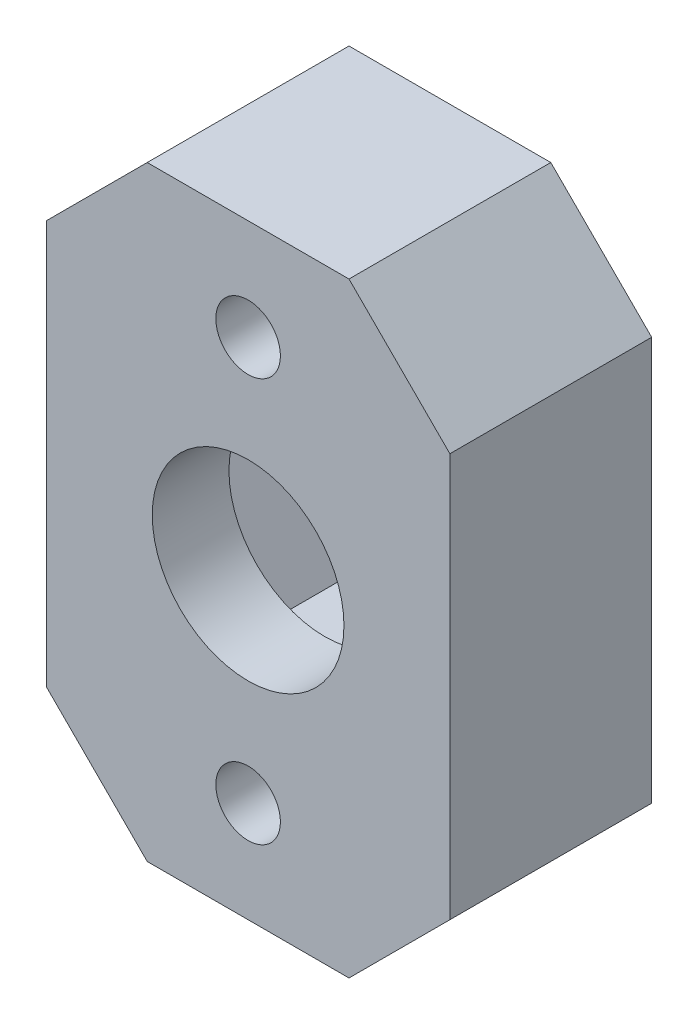
ISO-10303-21;
HEADER;
FILE_DESCRIPTION(('STEP AP214'),'2;1');
FILE_NAME('part.step','',(''),(''),'','','');
FILE_SCHEMA(('AUTOMOTIVE_DESIGN { 1 0 10303 214 1 1 1 1 }'));
ENDSEC;
DATA;
#1=APPLICATION_CONTEXT('core data for automotive mechanical design processes');
#2=APPLICATION_PROTOCOL_DEFINITION('international standard','automotive_design',2000,#1);
#3=PRODUCT_CONTEXT('',#1,'mechanical');
#4=PRODUCT('Part','Part','',(#3));
#5=PRODUCT_RELATED_PRODUCT_CATEGORY('part','',(#4));
#6=PRODUCT_DEFINITION_FORMATION('','',#4);
#7=PRODUCT_DEFINITION_CONTEXT('part definition',#1,'design');
#8=PRODUCT_DEFINITION('design','',#6,#7);
#9=PRODUCT_DEFINITION_SHAPE('','',#8);
#10=(LENGTH_UNIT() NAMED_UNIT(*) SI_UNIT(.MILLI.,.METRE.));
#11=(NAMED_UNIT(*) PLANE_ANGLE_UNIT() SI_UNIT($,.RADIAN.));
#12=(NAMED_UNIT(*) SI_UNIT($,.STERADIAN.) SOLID_ANGLE_UNIT());
#13=UNCERTAINTY_MEASURE_WITH_UNIT(LENGTH_MEASURE(1.E-05),#10,'distance_accuracy_value','');
#14=(GEOMETRIC_REPRESENTATION_CONTEXT(3) GLOBAL_UNCERTAINTY_ASSIGNED_CONTEXT((#13)) GLOBAL_UNIT_ASSIGNED_CONTEXT((#10,
#11,#12)) REPRESENTATION_CONTEXT('',''));
#15=CARTESIAN_POINT('',(0.,0.,0.));
#16=DIRECTION('',(0.,0.,1.));
#17=DIRECTION('',(1.,0.,0.));
#18=AXIS2_PLACEMENT_3D('',#15,#16,#17);
#19=CARTESIAN_POINT('',(3.72390923627309,-6.45,10.));
#20=DIRECTION('',(-0.866025403784439,0.5,0.));
#21=DIRECTION('',(-0.5,-0.866025403784439,0.));
#22=AXIS2_PLACEMENT_3D('',#19,#20,#21);
#23=PLANE('',#22);
#24=DIRECTION('',(0.,0.,-1.));
#25=VECTOR('',#24,1.);
#26=CARTESIAN_POINT('',(3.72390923627309,-6.45,10.));
#27=LINE('',#26,#25);
#28=CARTESIAN_POINT('',(3.72390923627309,-6.45,6.2));
#29=VERTEX_POINT('',#28);
#30=CARTESIAN_POINT('',(3.72390923627309,-6.45,0.));
#31=VERTEX_POINT('',#30);
#32=EDGE_CURVE('E154',#29,#31,#27,.T.);
#33=ORIENTED_EDGE('',*,*,#32,.F.);
#34=DIRECTION('',(0.5,0.866025403784439,0.));
#35=VECTOR('',#34,1.);
#36=CARTESIAN_POINT('',(3.72390923627309,-6.45,6.2));
#37=LINE('',#36,#35);
#38=CARTESIAN_POINT('',(7.44781847254617,0.,6.2));
#39=VERTEX_POINT('',#38);
#40=EDGE_CURVE('E48',#29,#39,#37,.T.);
#41=ORIENTED_EDGE('',*,*,#40,.T.);
#42=DIRECTION('',(0.,0.,-1.));
#43=VECTOR('',#42,1.);
#44=CARTESIAN_POINT('',(7.44781847254617,0.,10.));
#45=LINE('',#44,#43);
#46=CARTESIAN_POINT('',(7.44781847254617,0.,0.));
#47=VERTEX_POINT('',#46);
#48=EDGE_CURVE('E164',#39,#47,#45,.T.);
#49=ORIENTED_EDGE('',*,*,#48,.T.);
#50=DIRECTION('',(0.5,0.866025403784439,0.));
#51=VECTOR('',#50,1.);
#52=CARTESIAN_POINT('',(3.72390923627309,-6.45,0.));
#53=LINE('',#52,#51);
#54=EDGE_CURVE('E346',#31,#47,#53,.T.);
#55=ORIENTED_EDGE('',*,*,#54,.F.);
#56=EDGE_LOOP('',(#33,#41,#49,#55));
#57=FACE_BOUND('',#56,.T.);
#58=ADVANCED_FACE('F33',(#57),#23,.T.);
#59=CARTESIAN_POINT('',(7.44781847254617,0.,10.));
#60=DIRECTION('',(-0.866025403784438,-0.5,0.));
#61=DIRECTION('',(0.5,-0.866025403784439,0.));
#62=AXIS2_PLACEMENT_3D('',#59,#60,#61);
#63=PLANE('',#62);
#64=ORIENTED_EDGE('',*,*,#48,.F.);
#65=DIRECTION('',(-0.5,0.866025403784439,0.));
#66=VECTOR('',#65,1.);
#67=CARTESIAN_POINT('',(7.44781847254617,0.,6.2));
#68=LINE('',#67,#66);
#69=CARTESIAN_POINT('',(3.72390923627308,6.45,6.2));
#70=VERTEX_POINT('',#69);
#71=EDGE_CURVE('E331',#39,#70,#68,.T.);
#72=ORIENTED_EDGE('',*,*,#71,.T.);
#73=DIRECTION('',(0.,0.,-1.));
#74=VECTOR('',#73,1.);
#75=CARTESIAN_POINT('',(3.72390923627308,6.45,10.));
#76=LINE('',#75,#74);
#77=CARTESIAN_POINT('',(3.72390923627308,6.45,0.));
#78=VERTEX_POINT('',#77);
#79=EDGE_CURVE('E162',#70,#78,#76,.T.);
#80=ORIENTED_EDGE('',*,*,#79,.T.);
#81=DIRECTION('',(-0.5,0.866025403784438,0.));
#82=VECTOR('',#81,1.);
#83=CARTESIAN_POINT('',(7.44781847254617,0.,0.));
#84=LINE('',#83,#82);
#85=EDGE_CURVE('E329',#47,#78,#84,.T.);
#86=ORIENTED_EDGE('',*,*,#85,.F.);
#87=EDGE_LOOP('',(#64,#72,#80,#86));
#88=FACE_BOUND('',#87,.T.);
#89=ADVANCED_FACE('F265',(#88),#63,.T.);
#90=CARTESIAN_POINT('',(3.72390923627308,6.45,10.));
#91=DIRECTION('',(0.,-1.,0.));
#92=DIRECTION('',(1.,0.,0.));
#93=AXIS2_PLACEMENT_3D('',#90,#91,#92);
#94=PLANE('',#93);
#95=ORIENTED_EDGE('',*,*,#79,.F.);
#96=DIRECTION('',(-1.,0.,0.));
#97=VECTOR('',#96,1.);
#98=CARTESIAN_POINT('',(3.72390923627308,6.45,6.2));
#99=LINE('',#98,#97);
#100=CARTESIAN_POINT('',(-3.72390923627309,6.45,6.2));
#101=VERTEX_POINT('',#100);
#102=EDGE_CURVE('E321',#70,#101,#99,.T.);
#103=ORIENTED_EDGE('',*,*,#102,.T.);
#104=DIRECTION('',(0.,0.,-1.));
#105=VECTOR('',#104,1.);
#106=CARTESIAN_POINT('',(-3.72390923627309,6.45,10.));
#107=LINE('',#106,#105);
#108=CARTESIAN_POINT('',(-3.72390923627309,6.45,0.));
#109=VERTEX_POINT('',#108);
#110=EDGE_CURVE('E156',#101,#109,#107,.T.);
#111=ORIENTED_EDGE('',*,*,#110,.T.);
#112=DIRECTION('',(-1.,0.,0.));
#113=VECTOR('',#112,1.);
#114=CARTESIAN_POINT('',(3.72390923627308,6.45,0.));
#115=LINE('',#114,#113);
#116=EDGE_CURVE('E324',#78,#109,#115,.T.);
#117=ORIENTED_EDGE('',*,*,#116,.F.);
#118=EDGE_LOOP('',(#95,#103,#111,#117));
#119=FACE_BOUND('',#118,.T.);
#120=ADVANCED_FACE('F271',(#119),#94,.T.);
#121=CARTESIAN_POINT('',(-3.72390923627309,6.45,10.));
#122=DIRECTION('',(0.866025403784439,-0.5,0.));
#123=DIRECTION('',(0.5,0.866025403784439,0.));
#124=AXIS2_PLACEMENT_3D('',#121,#122,#123);
#125=PLANE('',#124);
#126=ORIENTED_EDGE('',*,*,#110,.F.);
#127=DIRECTION('',(-0.5,-0.866025403784439,0.));
#128=VECTOR('',#127,1.);
#129=CARTESIAN_POINT('',(-3.72390923627309,6.45,6.2));
#130=LINE('',#129,#128);
#131=CARTESIAN_POINT('',(-7.44781847254617,0.,6.2));
#132=VERTEX_POINT('',#131);
#133=EDGE_CURVE('E147',#101,#132,#130,.T.);
#134=ORIENTED_EDGE('',*,*,#133,.T.);
#135=DIRECTION('',(0.,0.,-1.));
#136=VECTOR('',#135,1.);
#137=CARTESIAN_POINT('',(-7.44781847254617,0.,10.));
#138=LINE('',#137,#136);
#139=CARTESIAN_POINT('',(-7.44781847254617,0.,0.));
#140=VERTEX_POINT('',#139);
#141=EDGE_CURVE('E146',#132,#140,#138,.T.);
#142=ORIENTED_EDGE('',*,*,#141,.T.);
#143=DIRECTION('',(-0.5,-0.866025403784438,0.));
#144=VECTOR('',#143,1.);
#145=CARTESIAN_POINT('',(-3.72390923627309,6.45,0.));
#146=LINE('',#145,#144);
#147=EDGE_CURVE('E352',#109,#140,#146,.T.);
#148=ORIENTED_EDGE('',*,*,#147,.F.);
#149=EDGE_LOOP('',(#126,#134,#142,#148));
#150=FACE_BOUND('',#149,.T.);
#151=ADVANCED_FACE('F311',(#150),#125,.T.);
#152=CARTESIAN_POINT('',(-7.44781847254617,0.,10.));
#153=DIRECTION('',(0.866025403784438,0.5,0.));
#154=DIRECTION('',(-0.5,0.866025403784439,0.));
#155=AXIS2_PLACEMENT_3D('',#152,#153,#154);
#156=PLANE('',#155);
#157=ORIENTED_EDGE('',*,*,#141,.F.);
#158=DIRECTION('',(0.5,-0.866025403784439,0.));
#159=VECTOR('',#158,1.);
#160=CARTESIAN_POINT('',(-7.44781847254617,0.,6.2));
#161=LINE('',#160,#159);
#162=CARTESIAN_POINT('',(-3.72390923627308,-6.45,6.2));
#163=VERTEX_POINT('',#162);
#164=EDGE_CURVE('E135',#132,#163,#161,.T.);
#165=ORIENTED_EDGE('',*,*,#164,.T.);
#166=DIRECTION('',(0.,0.,-1.));
#167=VECTOR('',#166,1.);
#168=CARTESIAN_POINT('',(-3.72390923627308,-6.45,10.));
#169=LINE('',#168,#167);
#170=CARTESIAN_POINT('',(-3.72390923627308,-6.45,0.));
#171=VERTEX_POINT('',#170);
#172=EDGE_CURVE('E144',#163,#171,#169,.T.);
#173=ORIENTED_EDGE('',*,*,#172,.T.);
#174=DIRECTION('',(0.5,-0.866025403784438,0.));
#175=VECTOR('',#174,1.);
#176=CARTESIAN_POINT('',(-7.44781847254617,0.,0.));
#177=LINE('',#176,#175);
#178=EDGE_CURVE('E355',#140,#171,#177,.T.);
#179=ORIENTED_EDGE('',*,*,#178,.F.);
#180=EDGE_LOOP('',(#157,#165,#173,#179));
#181=FACE_BOUND('',#180,.T.);
#182=ADVANCED_FACE('F142',(#181),#156,.T.);
#183=CARTESIAN_POINT('',(-3.72390923627308,-6.45,10.));
#184=DIRECTION('',(0.,1.,0.));
#185=DIRECTION('',(-1.,0.,0.));
#186=AXIS2_PLACEMENT_3D('',#183,#184,#185);
#187=PLANE('',#186);
#188=ORIENTED_EDGE('',*,*,#172,.F.);
#189=DIRECTION('',(1.,0.,0.));
#190=VECTOR('',#189,1.);
#191=CARTESIAN_POINT('',(-3.72390923627308,-6.45,6.2));
#192=LINE('',#191,#190);
#193=EDGE_CURVE('E11',#163,#29,#192,.T.);
#194=ORIENTED_EDGE('',*,*,#193,.T.);
#195=ORIENTED_EDGE('',*,*,#32,.T.);
#196=DIRECTION('',(1.,0.,0.));
#197=VECTOR('',#196,1.);
#198=CARTESIAN_POINT('',(-3.72390923627308,-6.45,0.));
#199=LINE('',#198,#197);
#200=EDGE_CURVE('E152',#171,#31,#199,.T.);
#201=ORIENTED_EDGE('',*,*,#200,.F.);
#202=EDGE_LOOP('',(#188,#194,#195,#201));
#203=FACE_BOUND('',#202,.T.);
#204=ADVANCED_FACE('F150',(#203),#187,.T.);
#205=CARTESIAN_POINT('',(0.,0.,10.));
#206=DIRECTION('',(0.,0.,1.));
#207=DIRECTION('',(1.,0.,0.));
#208=AXIS2_PLACEMENT_3D('',#205,#206,#207);
#209=PLANE('',#208);
#210=CARTESIAN_POINT('',(0.,10.,10.));
#211=DIRECTION('',(0.,0.,1.));
#212=DIRECTION('',(1.,0.,0.));
#213=AXIS2_PLACEMENT_3D('',#210,#211,#212);
#214=CIRCLE('',#213,1.6);
#215=CARTESIAN_POINT('',(1.6,10.,10.));
#216=VERTEX_POINT('',#215);
#217=EDGE_CURVE('E343',#216,#216,#214,.T.);
#218=ORIENTED_EDGE('',*,*,#217,.F.);
#219=EDGE_LOOP('',(#218));
#220=FACE_BOUND('',#219,.T.);
#221=DIRECTION('',(0.,-1.,0.));
#222=VECTOR('',#221,1.);
#223=CARTESIAN_POINT('',(-10.,15.,10.));
#224=LINE('',#223,#222);
#225=CARTESIAN_POINT('',(-10.,9.99999999999999,10.));
#226=VERTEX_POINT('',#225);
#227=CARTESIAN_POINT('',(-10.,-9.99999999999998,10.));
#228=VERTEX_POINT('',#227);
#229=EDGE_CURVE('E173',#226,#228,#224,.T.);
#230=ORIENTED_EDGE('',*,*,#229,.T.);
#231=DIRECTION('',(-0.707106781186546,0.707106781186549,0.));
#232=VECTOR('',#231,1.);
#233=CARTESIAN_POINT('',(-10.,-9.99999999999997,10.));
#234=LINE('',#233,#232);
#235=CARTESIAN_POINT('',(-5.00000000000001,-15.,10.));
#236=VERTEX_POINT('',#235);
#237=EDGE_CURVE('E212',#228,#236,#234,.F.);
#238=ORIENTED_EDGE('',*,*,#237,.T.);
#239=DIRECTION('',(1.,0.,0.));
#240=VECTOR('',#239,1.);
#241=CARTESIAN_POINT('',(-10.,-15.,10.));
#242=LINE('',#241,#240);
#243=CARTESIAN_POINT('',(4.99999999999997,-15.,10.));
#244=VERTEX_POINT('',#243);
#245=EDGE_CURVE('E176',#236,#244,#242,.T.);
#246=ORIENTED_EDGE('',*,*,#245,.T.);
#247=DIRECTION('',(-0.707106781186549,-0.707106781186547,0.));
#248=VECTOR('',#247,1.);
#249=CARTESIAN_POINT('',(9.99999999999998,-10.,10.));
#250=LINE('',#249,#248);
#251=CARTESIAN_POINT('',(10.,-9.99999999999998,10.));
#252=VERTEX_POINT('',#251);
#253=EDGE_CURVE('E210',#244,#252,#250,.F.);
#254=ORIENTED_EDGE('',*,*,#253,.T.);
#255=DIRECTION('',(0.,1.,0.));
#256=VECTOR('',#255,1.);
#257=CARTESIAN_POINT('',(9.99999999999999,15.,10.));
#258=LINE('',#257,#256);
#259=CARTESIAN_POINT('',(10.,9.99999999999998,10.));
#260=VERTEX_POINT('',#259);
#261=EDGE_CURVE('E167',#252,#260,#258,.T.);
#262=ORIENTED_EDGE('',*,*,#261,.T.);
#263=DIRECTION('',(0.707106781186547,-0.707106781186548,0.));
#264=VECTOR('',#263,1.);
#265=CARTESIAN_POINT('',(10.,9.99999999999998,10.));
#266=LINE('',#265,#264);
#267=CARTESIAN_POINT('',(4.99999999999999,15.,10.));
#268=VERTEX_POINT('',#267);
#269=EDGE_CURVE('E208',#260,#268,#266,.F.);
#270=ORIENTED_EDGE('',*,*,#269,.T.);
#271=DIRECTION('',(-1.,0.,0.));
#272=VECTOR('',#271,1.);
#273=CARTESIAN_POINT('',(-10.,15.,10.));
#274=LINE('',#273,#272);
#275=CARTESIAN_POINT('',(-4.99999999999998,15.,10.));
#276=VERTEX_POINT('',#275);
#277=EDGE_CURVE('E170',#268,#276,#274,.T.);
#278=ORIENTED_EDGE('',*,*,#277,.T.);
#279=DIRECTION('',(0.707106781186549,0.707106781186546,0.));
#280=VECTOR('',#279,1.);
#281=CARTESIAN_POINT('',(-9.99999999999998,10.,10.));
#282=LINE('',#281,#280);
#283=EDGE_CURVE('E206',#276,#226,#282,.F.);
#284=ORIENTED_EDGE('',*,*,#283,.T.);
#285=EDGE_LOOP('',(#230,#238,#246,#254,#262,#270,#278,#284));
#286=FACE_BOUND('',#285,.T.);
#287=CARTESIAN_POINT('',(0.,-10.,10.));
#288=DIRECTION('',(0.,0.,1.));
#289=DIRECTION('',(1.,0.,0.));
#290=AXIS2_PLACEMENT_3D('',#287,#288,#289);
#291=CIRCLE('',#290,1.6);
#292=CARTESIAN_POINT('',(1.6,-10.,10.));
#293=VERTEX_POINT('',#292);
#294=EDGE_CURVE('E338',#293,#293,#291,.T.);
#295=ORIENTED_EDGE('',*,*,#294,.F.);
#296=EDGE_LOOP('',(#295));
#297=FACE_BOUND('',#296,.T.);
#298=CARTESIAN_POINT('',(0.,0.,10.));
#299=DIRECTION('',(0.,0.,1.));
#300=DIRECTION('',(1.,0.,0.));
#301=AXIS2_PLACEMENT_3D('',#298,#299,#300);
#302=CIRCLE('',#301,4.75);
#303=CARTESIAN_POINT('',(4.75,0.,10.));
#304=VERTEX_POINT('',#303);
#305=EDGE_CURVE('E360',#304,#304,#302,.T.);
#306=ORIENTED_EDGE('',*,*,#305,.F.);
#307=EDGE_LOOP('',(#306));
#308=FACE_BOUND('',#307,.T.);
#309=ADVANCED_FACE('F240',(#220,#286,#297,#308),#209,.T.);
#310=CARTESIAN_POINT('',(0.,0.,0.));
#311=DIRECTION('',(0.,0.,1.));
#312=DIRECTION('',(1.,0.,0.));
#313=AXIS2_PLACEMENT_3D('',#310,#311,#312);
#314=PLANE('',#313);
#315=DIRECTION('',(1.,0.,0.));
#316=VECTOR('',#315,1.);
#317=CARTESIAN_POINT('',(-10.,-15.,0.));
#318=LINE('',#317,#316);
#319=CARTESIAN_POINT('',(-5.,-15.,0.));
#320=VERTEX_POINT('',#319);
#321=CARTESIAN_POINT('',(4.99999999999997,-15.,0.));
#322=VERTEX_POINT('',#321);
#323=EDGE_CURVE('E171',#320,#322,#318,.T.);
#324=ORIENTED_EDGE('',*,*,#323,.F.);
#325=DIRECTION('',(0.707106781186546,-0.707106781186549,0.));
#326=VECTOR('',#325,1.);
#327=CARTESIAN_POINT('',(-5.,-15.,0.));
#328=LINE('',#327,#326);
#329=CARTESIAN_POINT('',(-10.,-9.99999999999998,0.));
#330=VERTEX_POINT('',#329);
#331=EDGE_CURVE('E199',#320,#330,#328,.F.);
#332=ORIENTED_EDGE('',*,*,#331,.T.);
#333=DIRECTION('',(0.,-1.,0.));
#334=VECTOR('',#333,1.);
#335=CARTESIAN_POINT('',(-10.,15.,0.));
#336=LINE('',#335,#334);
#337=CARTESIAN_POINT('',(-10.,9.99999999999999,0.));
#338=VERTEX_POINT('',#337);
#339=EDGE_CURVE('E184',#338,#330,#336,.T.);
#340=ORIENTED_EDGE('',*,*,#339,.F.);
#341=DIRECTION('',(-0.707106781186549,-0.707106781186546,0.));
#342=VECTOR('',#341,1.);
#343=CARTESIAN_POINT('',(-10.,9.99999999999999,0.));
#344=LINE('',#343,#342);
#345=CARTESIAN_POINT('',(-4.99999999999998,15.,0.));
#346=VERTEX_POINT('',#345);
#347=EDGE_CURVE('E193',#338,#346,#344,.F.);
#348=ORIENTED_EDGE('',*,*,#347,.T.);
#349=DIRECTION('',(-1.,0.,0.));
#350=VECTOR('',#349,1.);
#351=CARTESIAN_POINT('',(-10.,15.,0.));
#352=LINE('',#351,#350);
#353=CARTESIAN_POINT('',(5.,15.,0.));
#354=VERTEX_POINT('',#353);
#355=EDGE_CURVE('E182',#354,#346,#352,.T.);
#356=ORIENTED_EDGE('',*,*,#355,.F.);
#357=DIRECTION('',(-0.707106781186547,0.707106781186548,0.));
#358=VECTOR('',#357,1.);
#359=CARTESIAN_POINT('',(5.,15.,0.));
#360=LINE('',#359,#358);
#361=CARTESIAN_POINT('',(10.,9.99999999999998,0.));
#362=VERTEX_POINT('',#361);
#363=EDGE_CURVE('E195',#354,#362,#360,.F.);
#364=ORIENTED_EDGE('',*,*,#363,.T.);
#365=DIRECTION('',(0.,1.,0.));
#366=VECTOR('',#365,1.);
#367=CARTESIAN_POINT('',(9.99999999999999,15.,0.));
#368=LINE('',#367,#366);
#369=CARTESIAN_POINT('',(10.,-9.99999999999998,0.));
#370=VERTEX_POINT('',#369);
#371=EDGE_CURVE('E166',#370,#362,#368,.T.);
#372=ORIENTED_EDGE('',*,*,#371,.F.);
#373=DIRECTION('',(0.707106781186549,0.707106781186547,0.));
#374=VECTOR('',#373,1.);
#375=CARTESIAN_POINT('',(10.,-9.99999999999998,0.));
#376=LINE('',#375,#374);
#377=EDGE_CURVE('E197',#370,#322,#376,.F.);
#378=ORIENTED_EDGE('',*,*,#377,.T.);
#379=EDGE_LOOP('',(#324,#332,#340,#348,#356,#364,#372,#378));
#380=FACE_BOUND('',#379,.T.);
#381=ORIENTED_EDGE('',*,*,#54,.T.);
#382=ORIENTED_EDGE('',*,*,#85,.T.);
#383=ORIENTED_EDGE('',*,*,#116,.T.);
#384=ORIENTED_EDGE('',*,*,#147,.T.);
#385=ORIENTED_EDGE('',*,*,#178,.T.);
#386=ORIENTED_EDGE('',*,*,#200,.T.);
#387=EDGE_LOOP('',(#381,#382,#383,#384,#385,#386));
#388=FACE_BOUND('',#387,.T.);
#389=CARTESIAN_POINT('',(0.,10.,0.));
#390=DIRECTION('',(0.,0.,1.));
#391=DIRECTION('',(1.,0.,0.));
#392=AXIS2_PLACEMENT_3D('',#389,#390,#391);
#393=CIRCLE('',#392,1.6);
#394=CARTESIAN_POINT('',(1.6,10.,0.));
#395=VERTEX_POINT('',#394);
#396=EDGE_CURVE('E340',#395,#395,#393,.T.);
#397=ORIENTED_EDGE('',*,*,#396,.T.);
#398=EDGE_LOOP('',(#397));
#399=FACE_BOUND('',#398,.T.);
#400=CARTESIAN_POINT('',(0.,-10.,0.));
#401=DIRECTION('',(0.,0.,1.));
#402=DIRECTION('',(1.,0.,0.));
#403=AXIS2_PLACEMENT_3D('',#400,#401,#402);
#404=CIRCLE('',#403,1.6);
#405=CARTESIAN_POINT('',(1.6,-10.,0.));
#406=VERTEX_POINT('',#405);
#407=EDGE_CURVE('E333',#406,#406,#404,.T.);
#408=ORIENTED_EDGE('',*,*,#407,.T.);
#409=EDGE_LOOP('',(#408));
#410=FACE_BOUND('',#409,.T.);
#411=ADVANCED_FACE('F227',(#380,#388,#399,#410),#314,.F.);
#412=CARTESIAN_POINT('',(9.99999999999999,15.,10.));
#413=DIRECTION('',(-1.,0.,0.));
#414=DIRECTION('',(0.,-1.,0.));
#415=AXIS2_PLACEMENT_3D('',#412,#413,#414);
#416=PLANE('',#415);
#417=ORIENTED_EDGE('',*,*,#261,.F.);
#418=DIRECTION('',(0.,0.,-1.));
#419=VECTOR('',#418,1.);
#420=CARTESIAN_POINT('',(10.,-9.99999999999998,10.));
#421=LINE('',#420,#419);
#422=EDGE_CURVE('E216',#252,#370,#421,.T.);
#423=ORIENTED_EDGE('',*,*,#422,.T.);
#424=ORIENTED_EDGE('',*,*,#371,.T.);
#425=DIRECTION('',(0.,0.,1.));
#426=VECTOR('',#425,1.);
#427=CARTESIAN_POINT('',(10.,9.99999999999998,10.));
#428=LINE('',#427,#426);
#429=EDGE_CURVE('E214',#362,#260,#428,.T.);
#430=ORIENTED_EDGE('',*,*,#429,.T.);
#431=EDGE_LOOP('',(#417,#423,#424,#430));
#432=FACE_BOUND('',#431,.T.);
#433=ADVANCED_FACE('F255',(#432),#416,.F.);
#434=CARTESIAN_POINT('',(-10.,15.,10.));
#435=DIRECTION('',(0.,-1.,0.));
#436=DIRECTION('',(0.,0.,-1.));
#437=AXIS2_PLACEMENT_3D('',#434,#435,#436);
#438=PLANE('',#437);
#439=ORIENTED_EDGE('',*,*,#277,.F.);
#440=DIRECTION('',(0.,0.,-1.));
#441=VECTOR('',#440,1.);
#442=CARTESIAN_POINT('',(5.,15.,10.));
#443=LINE('',#442,#441);
#444=EDGE_CURVE('E41',#268,#354,#443,.T.);
#445=ORIENTED_EDGE('',*,*,#444,.T.);
#446=ORIENTED_EDGE('',*,*,#355,.T.);
#447=DIRECTION('',(0.,0.,1.));
#448=VECTOR('',#447,1.);
#449=CARTESIAN_POINT('',(-4.99999999999998,15.,10.));
#450=LINE('',#449,#448);
#451=EDGE_CURVE('E55',#346,#276,#450,.T.);
#452=ORIENTED_EDGE('',*,*,#451,.T.);
#453=EDGE_LOOP('',(#439,#445,#446,#452));
#454=FACE_BOUND('',#453,.T.);
#455=ADVANCED_FACE('F222',(#454),#438,.F.);
#456=CARTESIAN_POINT('',(-10.,15.,10.));
#457=DIRECTION('',(1.,0.,0.));
#458=DIRECTION('',(0.,1.,0.));
#459=AXIS2_PLACEMENT_3D('',#456,#457,#458);
#460=PLANE('',#459);
#461=ORIENTED_EDGE('',*,*,#339,.T.);
#462=DIRECTION('',(0.,0.,1.));
#463=VECTOR('',#462,1.);
#464=CARTESIAN_POINT('',(-10.,-9.99999999999998,10.));
#465=LINE('',#464,#463);
#466=EDGE_CURVE('E204',#330,#228,#465,.T.);
#467=ORIENTED_EDGE('',*,*,#466,.T.);
#468=ORIENTED_EDGE('',*,*,#229,.F.);
#469=DIRECTION('',(0.,0.,-1.));
#470=VECTOR('',#469,1.);
#471=CARTESIAN_POINT('',(-10.,9.99999999999999,10.));
#472=LINE('',#471,#470);
#473=EDGE_CURVE('E201',#226,#338,#472,.T.);
#474=ORIENTED_EDGE('',*,*,#473,.T.);
#475=EDGE_LOOP('',(#461,#467,#468,#474));
#476=FACE_BOUND('',#475,.T.);
#477=ADVANCED_FACE('F236',(#476),#460,.F.);
#478=CARTESIAN_POINT('',(-10.,-15.,10.));
#479=DIRECTION('',(0.,1.,0.));
#480=DIRECTION('',(0.,0.,1.));
#481=AXIS2_PLACEMENT_3D('',#478,#479,#480);
#482=PLANE('',#481);
#483=ORIENTED_EDGE('',*,*,#245,.F.);
#484=DIRECTION('',(0.,0.,-1.));
#485=VECTOR('',#484,1.);
#486=CARTESIAN_POINT('',(-5.,-15.,10.));
#487=LINE('',#486,#485);
#488=EDGE_CURVE('E190',#236,#320,#487,.T.);
#489=ORIENTED_EDGE('',*,*,#488,.T.);
#490=ORIENTED_EDGE('',*,*,#323,.T.);
#491=DIRECTION('',(0.,0.,1.));
#492=VECTOR('',#491,1.);
#493=CARTESIAN_POINT('',(4.99999999999997,-15.,10.));
#494=LINE('',#493,#492);
#495=EDGE_CURVE('E179',#322,#244,#494,.T.);
#496=ORIENTED_EDGE('',*,*,#495,.T.);
#497=EDGE_LOOP('',(#483,#489,#490,#496));
#498=FACE_BOUND('',#497,.T.);
#499=ADVANCED_FACE('F247',(#498),#482,.F.);
#500=CARTESIAN_POINT('',(0.,10.,10.));
#501=DIRECTION('',(0.,0.,-1.));
#502=DIRECTION('',(-1.,0.,0.));
#503=AXIS2_PLACEMENT_3D('',#500,#501,#502);
#504=CYLINDRICAL_SURFACE('',#503,1.6);
#505=ORIENTED_EDGE('',*,*,#217,.T.);
#506=EDGE_LOOP('',(#505));
#507=FACE_BOUND('',#506,.T.);
#508=ORIENTED_EDGE('',*,*,#396,.F.);
#509=EDGE_LOOP('',(#508));
#510=FACE_BOUND('',#509,.T.);
#511=ADVANCED_FACE('F283',(#507,#510),#504,.F.);
#512=CARTESIAN_POINT('',(0.,-10.,10.));
#513=DIRECTION('',(0.,0.,-1.));
#514=DIRECTION('',(-1.,0.,0.));
#515=AXIS2_PLACEMENT_3D('',#512,#513,#514);
#516=CYLINDRICAL_SURFACE('',#515,1.6);
#517=ORIENTED_EDGE('',*,*,#294,.T.);
#518=EDGE_LOOP('',(#517));
#519=FACE_BOUND('',#518,.T.);
#520=ORIENTED_EDGE('',*,*,#407,.F.);
#521=EDGE_LOOP('',(#520));
#522=FACE_BOUND('',#521,.T.);
#523=ADVANCED_FACE('F291',(#519,#522),#516,.F.);
#524=CARTESIAN_POINT('',(-5.,-15.,10.));
#525=DIRECTION('',(0.707106781186549,0.707106781186546,0.));
#526=DIRECTION('',(0.,0.,-1.));
#527=AXIS2_PLACEMENT_3D('',#524,#525,#526);
#528=PLANE('',#527);
#529=ORIENTED_EDGE('',*,*,#237,.F.);
#530=ORIENTED_EDGE('',*,*,#466,.F.);
#531=ORIENTED_EDGE('',*,*,#331,.F.);
#532=ORIENTED_EDGE('',*,*,#488,.F.);
#533=EDGE_LOOP('',(#529,#530,#531,#532));
#534=FACE_BOUND('',#533,.T.);
#535=ADVANCED_FACE('F245',(#534),#528,.F.);
#536=CARTESIAN_POINT('',(10.,-9.99999999999998,10.));
#537=DIRECTION('',(-0.707106781186547,0.707106781186549,0.));
#538=DIRECTION('',(0.,0.,-1.));
#539=AXIS2_PLACEMENT_3D('',#536,#537,#538);
#540=PLANE('',#539);
#541=ORIENTED_EDGE('',*,*,#253,.F.);
#542=ORIENTED_EDGE('',*,*,#495,.F.);
#543=ORIENTED_EDGE('',*,*,#377,.F.);
#544=ORIENTED_EDGE('',*,*,#422,.F.);
#545=EDGE_LOOP('',(#541,#542,#543,#544));
#546=FACE_BOUND('',#545,.T.);
#547=ADVANCED_FACE('F252',(#546),#540,.F.);
#548=CARTESIAN_POINT('',(5.,15.,10.));
#549=DIRECTION('',(-0.707106781186548,-0.707106781186547,0.));
#550=DIRECTION('',(0.,0.,-1.));
#551=AXIS2_PLACEMENT_3D('',#548,#549,#550);
#552=PLANE('',#551);
#553=ORIENTED_EDGE('',*,*,#269,.F.);
#554=ORIENTED_EDGE('',*,*,#429,.F.);
#555=ORIENTED_EDGE('',*,*,#363,.F.);
#556=ORIENTED_EDGE('',*,*,#444,.F.);
#557=EDGE_LOOP('',(#553,#554,#555,#556));
#558=FACE_BOUND('',#557,.T.);
#559=ADVANCED_FACE('F257',(#558),#552,.F.);
#560=CARTESIAN_POINT('',(-10.,9.99999999999999,10.));
#561=DIRECTION('',(0.707106781186546,-0.707106781186549,0.));
#562=DIRECTION('',(0.,0.,-1.));
#563=AXIS2_PLACEMENT_3D('',#560,#561,#562);
#564=PLANE('',#563);
#565=ORIENTED_EDGE('',*,*,#283,.F.);
#566=ORIENTED_EDGE('',*,*,#451,.F.);
#567=ORIENTED_EDGE('',*,*,#347,.F.);
#568=ORIENTED_EDGE('',*,*,#473,.F.);
#569=EDGE_LOOP('',(#565,#566,#567,#568));
#570=FACE_BOUND('',#569,.T.);
#571=ADVANCED_FACE('F35',(#570),#564,.F.);
#572=CARTESIAN_POINT('',(0.,0.,6.2));
#573=DIRECTION('',(0.,0.,1.));
#574=DIRECTION('',(1.,0.,0.));
#575=AXIS2_PLACEMENT_3D('',#572,#573,#574);
#576=PLANE('',#575);
#577=ORIENTED_EDGE('',*,*,#40,.F.);
#578=ORIENTED_EDGE('',*,*,#193,.F.);
#579=ORIENTED_EDGE('',*,*,#164,.F.);
#580=ORIENTED_EDGE('',*,*,#133,.F.);
#581=ORIENTED_EDGE('',*,*,#102,.F.);
#582=ORIENTED_EDGE('',*,*,#71,.F.);
#583=EDGE_LOOP('',(#577,#578,#579,#580,#581,#582));
#584=FACE_BOUND('',#583,.T.);
#585=CARTESIAN_POINT('',(0.,0.,6.2));
#586=DIRECTION('',(0.,0.,1.));
#587=DIRECTION('',(1.,0.,0.));
#588=AXIS2_PLACEMENT_3D('',#585,#586,#587);
#589=CIRCLE('',#588,4.75);
#590=CARTESIAN_POINT('',(4.75,0.,6.2));
#591=VERTEX_POINT('',#590);
#592=EDGE_CURVE('E148',#591,#591,#589,.T.);
#593=ORIENTED_EDGE('',*,*,#592,.T.);
#594=EDGE_LOOP('',(#593));
#595=FACE_BOUND('',#594,.T.);
#596=ADVANCED_FACE('F133',(#584,#595),#576,.F.);
#597=CARTESIAN_POINT('',(0.,0.,6.2));
#598=DIRECTION('',(0.,0.,1.));
#599=DIRECTION('',(1.,0.,0.));
#600=AXIS2_PLACEMENT_3D('',#597,#598,#599);
#601=CYLINDRICAL_SURFACE('',#600,4.75);
#602=CARTESIAN_POINT('',(4.75,0.,6.2));
#603=CARTESIAN_POINT('',(4.75,0.,6.23958333333333));
#604=CARTESIAN_POINT('',(4.75,0.,6.27916666666667));
#605=CARTESIAN_POINT('',(4.75,0.,6.35833333333333));
#606=CARTESIAN_POINT('',(4.75,0.,6.39791666666667));
#607=CARTESIAN_POINT('',(4.75,0.,6.47708333333333));
#608=CARTESIAN_POINT('',(4.75,0.,6.51666666666667));
#609=CARTESIAN_POINT('',(4.75,0.,6.59583333333333));
#610=CARTESIAN_POINT('',(4.75,0.,6.63541666666667));
#611=CARTESIAN_POINT('',(4.75,0.,6.71458333333333));
#612=CARTESIAN_POINT('',(4.75,0.,6.75416666666667));
#613=CARTESIAN_POINT('',(4.75,0.,6.83333333333333));
#614=CARTESIAN_POINT('',(4.75,0.,6.87291666666667));
#615=CARTESIAN_POINT('',(4.75,0.,6.95208333333333));
#616=CARTESIAN_POINT('',(4.75,0.,6.99166666666667));
#617=CARTESIAN_POINT('',(4.75,0.,7.07083333333333));
#618=CARTESIAN_POINT('',(4.75,0.,7.11041666666667));
#619=CARTESIAN_POINT('',(4.75,0.,7.18958333333333));
#620=CARTESIAN_POINT('',(4.75,0.,7.22916666666667));
#621=CARTESIAN_POINT('',(4.75,0.,7.30833333333333));
#622=CARTESIAN_POINT('',(4.75,0.,7.34791666666667));
#623=CARTESIAN_POINT('',(4.75,0.,7.42708333333333));
#624=CARTESIAN_POINT('',(4.75,0.,7.46666666666667));
#625=CARTESIAN_POINT('',(4.75,0.,7.54583333333333));
#626=CARTESIAN_POINT('',(4.75,0.,7.58541666666667));
#627=CARTESIAN_POINT('',(4.75,0.,7.66458333333333));
#628=CARTESIAN_POINT('',(4.75,0.,7.70416666666667));
#629=CARTESIAN_POINT('',(4.75,0.,7.78333333333333));
#630=CARTESIAN_POINT('',(4.75,0.,7.82291666666667));
#631=CARTESIAN_POINT('',(4.75,0.,7.90208333333333));
#632=CARTESIAN_POINT('',(4.75,0.,7.94166666666667));
#633=CARTESIAN_POINT('',(4.75,0.,8.02083333333333));
#634=CARTESIAN_POINT('',(4.75,0.,8.06041666666667));
#635=CARTESIAN_POINT('',(4.75,0.,8.13958333333333));
#636=CARTESIAN_POINT('',(4.75,0.,8.17916666666667));
#637=CARTESIAN_POINT('',(4.75,0.,8.25833333333333));
#638=CARTESIAN_POINT('',(4.75,0.,8.29791666666667));
#639=CARTESIAN_POINT('',(4.75,0.,8.37708333333333));
#640=CARTESIAN_POINT('',(4.75,0.,8.41666666666667));
#641=CARTESIAN_POINT('',(4.75,0.,8.49583333333333));
#642=CARTESIAN_POINT('',(4.75,0.,8.53541666666667));
#643=CARTESIAN_POINT('',(4.75,0.,8.61458333333333));
#644=CARTESIAN_POINT('',(4.75,0.,8.65416666666667));
#645=CARTESIAN_POINT('',(4.75,0.,8.73333333333333));
#646=CARTESIAN_POINT('',(4.75,0.,8.77291666666667));
#647=CARTESIAN_POINT('',(4.75,0.,8.85208333333333));
#648=CARTESIAN_POINT('',(4.75,0.,8.89166666666667));
#649=CARTESIAN_POINT('',(4.75,0.,8.97083333333333));
#650=CARTESIAN_POINT('',(4.75,0.,9.01041666666667));
#651=CARTESIAN_POINT('',(4.75,0.,9.08958333333333));
#652=CARTESIAN_POINT('',(4.75,0.,9.12916666666667));
#653=CARTESIAN_POINT('',(4.75,0.,9.20833333333333));
#654=CARTESIAN_POINT('',(4.75,0.,9.24791666666667));
#655=CARTESIAN_POINT('',(4.75,0.,9.32708333333333));
#656=CARTESIAN_POINT('',(4.75,0.,9.36666666666667));
#657=CARTESIAN_POINT('',(4.75,0.,9.44583333333333));
#658=CARTESIAN_POINT('',(4.75,0.,9.48541666666667));
#659=CARTESIAN_POINT('',(4.75,0.,9.56458333333333));
#660=CARTESIAN_POINT('',(4.75,0.,9.60416666666667));
#661=CARTESIAN_POINT('',(4.75,0.,9.68333333333333));
#662=CARTESIAN_POINT('',(4.75,0.,9.72291666666667));
#663=CARTESIAN_POINT('',(4.75,0.,9.80208333333333));
#664=CARTESIAN_POINT('',(4.75,0.,9.84166666666667));
#665=CARTESIAN_POINT('',(4.75,0.,9.92083333333333));
#666=CARTESIAN_POINT('',(4.75,0.,9.96041666666667));
#667=CARTESIAN_POINT('',(4.75,0.,10.));
#668=B_SPLINE_CURVE_WITH_KNOTS('',3,(#602,#603,#604,#605,#606,#607,#608,#609,#610,#611,#612,
#613,#614,#615,#616,#617,#618,#619,#620,#621,#622,#623,#624,#625,#626,#627,#628,#629,#630,#631,
#632,#633,#634,#635,#636,#637,#638,#639,#640,#641,#642,#643,#644,#645,#646,#647,#648,#649,#650,
#651,#652,#653,#654,#655,#656,#657,#658,#659,#660,#661,#662,#663,#664,#665,#666,#667),
.UNSPECIFIED.,.F.,.F.,(4,2,2,2,2,2,2,2,2,2,2,2,2,2,2,2,2,2,2,2,2,2,2,2,2,2,2,2,2,2,2,2,4),(0.,
0.11875,0.2375,0.35625,0.475,0.59375,0.7125,0.831249999999999,0.95,1.06875,1.1875,1.30625,1.425,
1.54375,1.6625,1.78125,1.9,2.01875,2.1375,2.25625,2.375,2.49375,2.6125,2.73125,2.85,2.96875,
3.0875,3.20625,3.325,3.44375,3.5625,3.68125,3.8),.UNSPECIFIED.);
#669=EDGE_CURVE('BSEAM366',#591,#304,#668,.T.);
#670=ORIENTED_EDGE('',*,*,#592,.F.);
#671=ORIENTED_EDGE('',*,*,#305,.T.);
#672=ORIENTED_EDGE('',*,*,#669,.T.);
#673=ORIENTED_EDGE('',*,*,#669,.F.);
#674=EDGE_LOOP('',(#670,#672,#671,#673));
#675=FACE_BOUND('',#674,.T.);
#676=ADVANCED_FACE('F366',(#675),#601,.F.);
#677=CLOSED_SHELL('',(#58,#89,#120,#151,#182,#204,#309,#411,#433,#455,#477,#499,#511,#523,#535,
#547,#559,#571,#596,#676));
#678=MANIFOLD_SOLID_BREP('B2',#677);
#679=ADVANCED_BREP_SHAPE_REPRESENTATION('',(#18,#678),#14);
#680=SHAPE_DEFINITION_REPRESENTATION(#9,#679);
ENDSEC;
END-ISO-10303-21;
